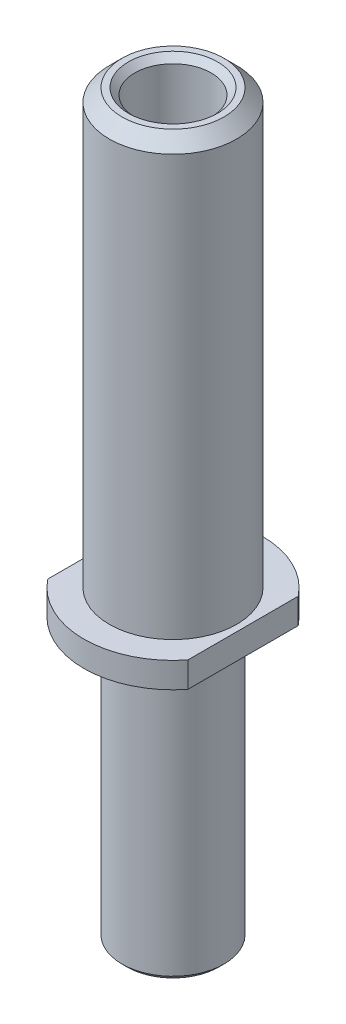
ISO-10303-21;
HEADER;
FILE_DESCRIPTION(('STEP AP214'),'2;1');
FILE_NAME('part.step','',(''),(''),'','','');
FILE_SCHEMA(('AUTOMOTIVE_DESIGN { 1 0 10303 214 1 1 1 1 }'));
ENDSEC;
DATA;
#1=APPLICATION_CONTEXT('core data for automotive mechanical design processes');
#2=APPLICATION_PROTOCOL_DEFINITION('international standard','automotive_design',2000,#1);
#3=PRODUCT_CONTEXT('',#1,'mechanical');
#4=PRODUCT('Part','Part','',(#3));
#5=PRODUCT_RELATED_PRODUCT_CATEGORY('part','',(#4));
#6=PRODUCT_DEFINITION_FORMATION('','',#4);
#7=PRODUCT_DEFINITION_CONTEXT('part definition',#1,'design');
#8=PRODUCT_DEFINITION('design','',#6,#7);
#9=PRODUCT_DEFINITION_SHAPE('','',#8);
#10=(LENGTH_UNIT() NAMED_UNIT(*) SI_UNIT(.MILLI.,.METRE.));
#11=(NAMED_UNIT(*) PLANE_ANGLE_UNIT() SI_UNIT($,.RADIAN.));
#12=(NAMED_UNIT(*) SI_UNIT($,.STERADIAN.) SOLID_ANGLE_UNIT());
#13=UNCERTAINTY_MEASURE_WITH_UNIT(LENGTH_MEASURE(1.E-05),#10,'distance_accuracy_value','');
#14=(GEOMETRIC_REPRESENTATION_CONTEXT(3) GLOBAL_UNCERTAINTY_ASSIGNED_CONTEXT((#13)) GLOBAL_UNIT_ASSIGNED_CONTEXT((#10,
#11,#12)) REPRESENTATION_CONTEXT('',''));
#15=CARTESIAN_POINT('',(0.,0.,0.));
#16=DIRECTION('',(0.,0.,1.));
#17=DIRECTION('',(1.,0.,0.));
#18=AXIS2_PLACEMENT_3D('',#15,#16,#17);
#19=CARTESIAN_POINT('',(0.,12.,3.5));
#20=DIRECTION('',(0.,1.,0.));
#21=DIRECTION('',(0.,0.,1.));
#22=AXIS2_PLACEMENT_3D('',#19,#20,#21);
#23=PLANE('',#22);
#24=CARTESIAN_POINT('',(0.,12.,0.));
#25=DIRECTION('',(0.,1.,0.));
#26=DIRECTION('',(0.,0.,1.));
#27=AXIS2_PLACEMENT_3D('',#24,#25,#26);
#28=CIRCLE('',#27,2.5);
#29=CARTESIAN_POINT('',(0.,12.,2.5));
#30=VERTEX_POINT('',#29);
#31=EDGE_CURVE('E121',#30,#30,#28,.T.);
#32=ORIENTED_EDGE('',*,*,#31,.F.);
#33=EDGE_LOOP('',(#32));
#34=FACE_BOUND('',#33,.T.);
#35=CARTESIAN_POINT('',(0.,12.,0.));
#36=DIRECTION('',(0.,1.,0.));
#37=DIRECTION('',(0.,0.,1.));
#38=AXIS2_PLACEMENT_3D('',#35,#36,#37);
#39=CIRCLE('',#38,3.5);
#40=CARTESIAN_POINT('',(2.75,12.,-2.16506350946109));
#41=VERTEX_POINT('',#40);
#42=CARTESIAN_POINT('',(-2.75,12.,-2.16506350946109));
#43=VERTEX_POINT('',#42);
#44=EDGE_CURVE('E120',#41,#43,#39,.T.);
#45=ORIENTED_EDGE('',*,*,#44,.T.);
#46=DIRECTION('',(0.,0.,-1.));
#47=VECTOR('',#46,1.);
#48=CARTESIAN_POINT('',(-2.75,12.,-2.16506350946109));
#49=LINE('',#48,#47);
#50=CARTESIAN_POINT('',(-2.75,12.,2.16506350946109));
#51=VERTEX_POINT('',#50);
#52=EDGE_CURVE('E94',#51,#43,#49,.T.);
#53=ORIENTED_EDGE('',*,*,#52,.F.);
#54=CARTESIAN_POINT('',(2.75,12.,2.16506350946109));
#55=VERTEX_POINT('',#54);
#56=EDGE_CURVE('E102',#51,#55,#39,.T.);
#57=ORIENTED_EDGE('',*,*,#56,.T.);
#58=DIRECTION('',(0.,0.,1.));
#59=VECTOR('',#58,1.);
#60=CARTESIAN_POINT('',(2.75,12.,-2.16506350946109));
#61=LINE('',#60,#59);
#62=EDGE_CURVE('E283',#41,#55,#61,.T.);
#63=ORIENTED_EDGE('',*,*,#62,.F.);
#64=EDGE_LOOP('',(#45,#53,#57,#63));
#65=FACE_BOUND('',#64,.T.);
#66=ADVANCED_FACE('F45',(#34,#65),#23,.T.);
#67=CARTESIAN_POINT('',(0.,29.,0.));
#68=DIRECTION('',(0.,1.,0.));
#69=DIRECTION('',(0.,0.,1.));
#70=AXIS2_PLACEMENT_3D('',#67,#68,#69);
#71=CYLINDRICAL_SURFACE('',#70,3.5);
#72=ORIENTED_EDGE('',*,*,#56,.F.);
#73=DIRECTION('',(0.,-1.,0.));
#74=VECTOR('',#73,1.);
#75=CARTESIAN_POINT('',(-2.75,29.001,2.16506350946109));
#76=LINE('',#75,#74);
#77=CARTESIAN_POINT('',(-2.75,11.,2.16506350946109));
#78=VERTEX_POINT('',#77);
#79=EDGE_CURVE('E87',#51,#78,#76,.T.);
#80=ORIENTED_EDGE('',*,*,#79,.T.);
#81=CARTESIAN_POINT('',(0.,11.,0.));
#82=DIRECTION('',(0.,1.,0.));
#83=DIRECTION('',(0.,0.,1.));
#84=AXIS2_PLACEMENT_3D('',#81,#82,#83);
#85=CIRCLE('',#84,3.5);
#86=CARTESIAN_POINT('',(2.75,11.,2.16506350946109));
#87=VERTEX_POINT('',#86);
#88=EDGE_CURVE('E100',#78,#87,#85,.T.);
#89=ORIENTED_EDGE('',*,*,#88,.T.);
#90=DIRECTION('',(0.,-1.,0.));
#91=VECTOR('',#90,1.);
#92=CARTESIAN_POINT('',(2.75,29.001,2.16506350946109));
#93=LINE('',#92,#91);
#94=EDGE_CURVE('E69',#55,#87,#93,.T.);
#95=ORIENTED_EDGE('',*,*,#94,.F.);
#96=EDGE_LOOP('',(#72,#80,#89,#95));
#97=FACE_BOUND('',#96,.T.);
#98=ADVANCED_FACE('F99',(#97),#71,.T.);
#99=CARTESIAN_POINT('',(2.75,11.,-2.16506350946109));
#100=VERTEX_POINT('',#99);
#101=CARTESIAN_POINT('',(-2.75,11.,-2.16506350946109));
#102=VERTEX_POINT('',#101);
#103=EDGE_CURVE('E108',#100,#102,#85,.T.);
#104=ORIENTED_EDGE('',*,*,#103,.T.);
#105=DIRECTION('',(0.,-1.,0.));
#106=VECTOR('',#105,1.);
#107=CARTESIAN_POINT('',(-2.75,29.001,-2.16506350946109));
#108=LINE('',#107,#106);
#109=EDGE_CURVE('E61',#43,#102,#108,.T.);
#110=ORIENTED_EDGE('',*,*,#109,.F.);
#111=ORIENTED_EDGE('',*,*,#44,.F.);
#112=DIRECTION('',(0.,-1.,0.));
#113=VECTOR('',#112,1.);
#114=CARTESIAN_POINT('',(2.75,29.001,-2.16506350946109));
#115=LINE('',#114,#113);
#116=EDGE_CURVE('E305',#41,#100,#115,.T.);
#117=ORIENTED_EDGE('',*,*,#116,.T.);
#118=EDGE_LOOP('',(#104,#110,#111,#117));
#119=FACE_BOUND('',#118,.T.);
#120=ADVANCED_FACE('F154',(#119),#71,.T.);
#121=CARTESIAN_POINT('',(0.,11.,2.));
#122=DIRECTION('',(0.,-1.,0.));
#123=DIRECTION('',(0.,0.,-1.));
#124=AXIS2_PLACEMENT_3D('',#121,#122,#123);
#125=PLANE('',#124);
#126=CARTESIAN_POINT('',(0.,11.,0.));
#127=DIRECTION('',(0.,1.,0.));
#128=DIRECTION('',(0.,0.,1.));
#129=AXIS2_PLACEMENT_3D('',#126,#127,#128);
#130=CIRCLE('',#129,2.);
#131=CARTESIAN_POINT('',(0.,11.,2.));
#132=VERTEX_POINT('',#131);
#133=EDGE_CURVE('E109',#132,#132,#130,.T.);
#134=ORIENTED_EDGE('',*,*,#133,.T.);
#135=EDGE_LOOP('',(#134));
#136=FACE_BOUND('',#135,.T.);
#137=ORIENTED_EDGE('',*,*,#88,.F.);
#138=DIRECTION('',(0.,0.,1.));
#139=VECTOR('',#138,1.);
#140=CARTESIAN_POINT('',(-2.75,11.,-2.16506350946109));
#141=LINE('',#140,#139);
#142=EDGE_CURVE('E84',#102,#78,#141,.T.);
#143=ORIENTED_EDGE('',*,*,#142,.F.);
#144=ORIENTED_EDGE('',*,*,#103,.F.);
#145=DIRECTION('',(0.,0.,-1.));
#146=VECTOR('',#145,1.);
#147=CARTESIAN_POINT('',(2.75,11.,-2.16506350946109));
#148=LINE('',#147,#146);
#149=EDGE_CURVE('E106',#87,#100,#148,.T.);
#150=ORIENTED_EDGE('',*,*,#149,.F.);
#151=EDGE_LOOP('',(#137,#143,#144,#150));
#152=FACE_BOUND('',#151,.T.);
#153=ADVANCED_FACE('F105',(#136,#152),#125,.T.);
#154=CARTESIAN_POINT('',(0.,28.75,0.));
#155=DIRECTION('',(0.,1.,0.));
#156=DIRECTION('',(0.,0.,1.));
#157=AXIS2_PLACEMENT_3D('',#154,#155,#156);
#158=CONICAL_SURFACE('',#157,1.5,0.785398163397448);
#159=CARTESIAN_POINT('',(0.,29.,0.));
#160=DIRECTION('',(0.,1.,0.));
#161=DIRECTION('',(0.,0.,1.));
#162=AXIS2_PLACEMENT_3D('',#159,#160,#161);
#163=CIRCLE('',#162,1.75);
#164=CARTESIAN_POINT('',(0.,29.,1.75));
#165=VERTEX_POINT('',#164);
#166=EDGE_CURVE('E11',#165,#165,#163,.T.);
#167=ORIENTED_EDGE('',*,*,#166,.T.);
#168=EDGE_LOOP('',(#167));
#169=FACE_BOUND('',#168,.T.);
#170=CARTESIAN_POINT('',(0.,28.75,0.));
#171=DIRECTION('',(0.,1.,0.));
#172=DIRECTION('',(0.,0.,1.));
#173=AXIS2_PLACEMENT_3D('',#170,#171,#172);
#174=CIRCLE('',#173,1.5);
#175=CARTESIAN_POINT('',(0.,28.75,1.5));
#176=VERTEX_POINT('',#175);
#177=EDGE_CURVE('E272',#176,#176,#174,.T.);
#178=ORIENTED_EDGE('',*,*,#177,.F.);
#179=EDGE_LOOP('',(#178));
#180=FACE_BOUND('',#179,.T.);
#181=ADVANCED_FACE('F47',(#169,#180),#158,.F.);
#182=CARTESIAN_POINT('',(0.,29.,1.75));
#183=DIRECTION('',(0.,1.,0.));
#184=DIRECTION('',(0.,0.,1.));
#185=AXIS2_PLACEMENT_3D('',#182,#183,#184);
#186=PLANE('',#185);
#187=CARTESIAN_POINT('',(0.,29.,0.));
#188=DIRECTION('',(0.,1.,0.));
#189=DIRECTION('',(0.,0.,1.));
#190=AXIS2_PLACEMENT_3D('',#187,#188,#189);
#191=CIRCLE('',#190,2.);
#192=CARTESIAN_POINT('',(0.,29.,2.));
#193=VERTEX_POINT('',#192);
#194=EDGE_CURVE('E54',#193,#193,#191,.T.);
#195=ORIENTED_EDGE('',*,*,#194,.T.);
#196=EDGE_LOOP('',(#195));
#197=FACE_BOUND('',#196,.T.);
#198=ORIENTED_EDGE('',*,*,#166,.F.);
#199=EDGE_LOOP('',(#198));
#200=FACE_BOUND('',#199,.T.);
#201=ADVANCED_FACE('F132',(#197,#200),#186,.T.);
#202=CARTESIAN_POINT('',(0.,29.,0.));
#203=DIRECTION('',(0.,-1.,0.));
#204=DIRECTION('',(0.,0.,-1.));
#205=AXIS2_PLACEMENT_3D('',#202,#203,#204);
#206=CONICAL_SURFACE('',#205,2.,0.785398163397448);
#207=CARTESIAN_POINT('',(0.,28.5,0.));
#208=DIRECTION('',(0.,1.,0.));
#209=DIRECTION('',(0.,0.,1.));
#210=AXIS2_PLACEMENT_3D('',#207,#208,#209);
#211=CIRCLE('',#210,2.5);
#212=CARTESIAN_POINT('',(0.,28.5,2.5));
#213=VERTEX_POINT('',#212);
#214=EDGE_CURVE('E125',#213,#213,#211,.T.);
#215=ORIENTED_EDGE('',*,*,#214,.T.);
#216=EDGE_LOOP('',(#215));
#217=FACE_BOUND('',#216,.T.);
#218=ORIENTED_EDGE('',*,*,#194,.F.);
#219=EDGE_LOOP('',(#218));
#220=FACE_BOUND('',#219,.T.);
#221=ADVANCED_FACE('F135',(#217,#220),#206,.T.);
#222=CARTESIAN_POINT('',(0.,29.,0.));
#223=DIRECTION('',(0.,1.,0.));
#224=DIRECTION('',(0.,0.,1.));
#225=AXIS2_PLACEMENT_3D('',#222,#223,#224);
#226=CYLINDRICAL_SURFACE('',#225,2.5);
#227=ORIENTED_EDGE('',*,*,#31,.T.);
#228=EDGE_LOOP('',(#227));
#229=FACE_BOUND('',#228,.T.);
#230=ORIENTED_EDGE('',*,*,#214,.F.);
#231=EDGE_LOOP('',(#230));
#232=FACE_BOUND('',#231,.T.);
#233=ADVANCED_FACE('F137',(#229,#232),#226,.T.);
#234=CARTESIAN_POINT('',(0.,29.,0.));
#235=DIRECTION('',(0.,1.,0.));
#236=DIRECTION('',(0.,0.,1.));
#237=AXIS2_PLACEMENT_3D('',#234,#235,#236);
#238=CYLINDRICAL_SURFACE('',#237,2.);
#239=CARTESIAN_POINT('',(0.,0.199999999999999,0.));
#240=DIRECTION('',(0.,1.,0.));
#241=DIRECTION('',(0.,0.,1.));
#242=AXIS2_PLACEMENT_3D('',#239,#240,#241);
#243=CIRCLE('',#242,2.);
#244=CARTESIAN_POINT('',(0.,0.199999999999999,2.));
#245=VERTEX_POINT('',#244);
#246=EDGE_CURVE('E114',#245,#245,#243,.T.);
#247=ORIENTED_EDGE('',*,*,#246,.T.);
#248=EDGE_LOOP('',(#247));
#249=FACE_BOUND('',#248,.T.);
#250=ORIENTED_EDGE('',*,*,#133,.F.);
#251=EDGE_LOOP('',(#250));
#252=FACE_BOUND('',#251,.T.);
#253=ADVANCED_FACE('F144',(#249,#252),#238,.T.);
#254=CARTESIAN_POINT('',(0.,0.199999999999999,0.));
#255=DIRECTION('',(0.,1.,0.));
#256=DIRECTION('',(0.,0.,1.));
#257=AXIS2_PLACEMENT_3D('',#254,#255,#256);
#258=CONICAL_SURFACE('',#257,2.,0.785398163397452);
#259=CARTESIAN_POINT('',(0.,0.,0.));
#260=DIRECTION('',(0.,1.,0.));
#261=DIRECTION('',(0.,0.,1.));
#262=AXIS2_PLACEMENT_3D('',#259,#260,#261);
#263=CIRCLE('',#262,1.8);
#264=CARTESIAN_POINT('',(0.,0.,1.8));
#265=VERTEX_POINT('',#264);
#266=EDGE_CURVE('E289',#265,#265,#263,.T.);
#267=ORIENTED_EDGE('',*,*,#266,.T.);
#268=EDGE_LOOP('',(#267));
#269=FACE_BOUND('',#268,.T.);
#270=ORIENTED_EDGE('',*,*,#246,.F.);
#271=EDGE_LOOP('',(#270));
#272=FACE_BOUND('',#271,.T.);
#273=ADVANCED_FACE('F164',(#269,#272),#258,.T.);
#274=CARTESIAN_POINT('',(0.,0.,1.7));
#275=DIRECTION('',(0.,-1.,0.));
#276=DIRECTION('',(0.,0.,-1.));
#277=AXIS2_PLACEMENT_3D('',#274,#275,#276);
#278=PLANE('',#277);
#279=CARTESIAN_POINT('',(0.,0.,0.));
#280=DIRECTION('',(0.,1.,0.));
#281=DIRECTION('',(0.,0.,1.));
#282=AXIS2_PLACEMENT_3D('',#279,#280,#281);
#283=CIRCLE('',#282,1.7);
#284=CARTESIAN_POINT('',(0.,0.,1.7));
#285=VERTEX_POINT('',#284);
#286=EDGE_CURVE('E279',#285,#285,#283,.T.);
#287=ORIENTED_EDGE('',*,*,#286,.T.);
#288=EDGE_LOOP('',(#287));
#289=FACE_BOUND('',#288,.T.);
#290=ORIENTED_EDGE('',*,*,#266,.F.);
#291=EDGE_LOOP('',(#290));
#292=FACE_BOUND('',#291,.T.);
#293=ADVANCED_FACE('F168',(#289,#292),#278,.T.);
#294=CARTESIAN_POINT('',(0.,0.,0.));
#295=DIRECTION('',(0.,-1.,0.));
#296=DIRECTION('',(0.,0.,-1.));
#297=AXIS2_PLACEMENT_3D('',#294,#295,#296);
#298=CONICAL_SURFACE('',#297,1.7,0.785398163397452);
#299=CARTESIAN_POINT('',(0.,0.199999999999999,0.));
#300=DIRECTION('',(0.,1.,0.));
#301=DIRECTION('',(0.,0.,1.));
#302=AXIS2_PLACEMENT_3D('',#299,#300,#301);
#303=CIRCLE('',#302,1.5);
#304=CARTESIAN_POINT('',(0.,0.199999999999999,1.5));
#305=VERTEX_POINT('',#304);
#306=EDGE_CURVE('E274',#305,#305,#303,.T.);
#307=ORIENTED_EDGE('',*,*,#306,.T.);
#308=EDGE_LOOP('',(#307));
#309=FACE_BOUND('',#308,.T.);
#310=ORIENTED_EDGE('',*,*,#286,.F.);
#311=EDGE_LOOP('',(#310));
#312=FACE_BOUND('',#311,.T.);
#313=ADVANCED_FACE('F172',(#309,#312),#298,.F.);
#314=CARTESIAN_POINT('',(0.,29.,0.));
#315=DIRECTION('',(0.,1.,0.));
#316=DIRECTION('',(0.,0.,1.));
#317=AXIS2_PLACEMENT_3D('',#314,#315,#316);
#318=CYLINDRICAL_SURFACE('',#317,1.5);
#319=ORIENTED_EDGE('',*,*,#177,.T.);
#320=EDGE_LOOP('',(#319));
#321=FACE_BOUND('',#320,.T.);
#322=ORIENTED_EDGE('',*,*,#306,.F.);
#323=EDGE_LOOP('',(#322));
#324=FACE_BOUND('',#323,.T.);
#325=ADVANCED_FACE('F176',(#321,#324),#318,.F.);
#326=CARTESIAN_POINT('',(2.75,29.001,-2.16506350946109));
#327=DIRECTION('',(1.,0.,0.));
#328=DIRECTION('',(0.,0.,-1.));
#329=AXIS2_PLACEMENT_3D('',#326,#327,#328);
#330=PLANE('',#329);
#331=ORIENTED_EDGE('',*,*,#62,.T.);
#332=ORIENTED_EDGE('',*,*,#94,.T.);
#333=ORIENTED_EDGE('',*,*,#149,.T.);
#334=ORIENTED_EDGE('',*,*,#116,.F.);
#335=EDGE_LOOP('',(#331,#332,#333,#334));
#336=FACE_BOUND('',#335,.T.);
#337=ADVANCED_FACE('F179',(#336),#330,.T.);
#338=CARTESIAN_POINT('',(-2.75,29.001,-2.16506350946109));
#339=DIRECTION('',(-1.,0.,0.));
#340=DIRECTION('',(0.,0.,1.));
#341=AXIS2_PLACEMENT_3D('',#338,#339,#340);
#342=PLANE('',#341);
#343=ORIENTED_EDGE('',*,*,#52,.T.);
#344=ORIENTED_EDGE('',*,*,#109,.T.);
#345=ORIENTED_EDGE('',*,*,#142,.T.);
#346=ORIENTED_EDGE('',*,*,#79,.F.);
#347=EDGE_LOOP('',(#343,#344,#345,#346));
#348=FACE_BOUND('',#347,.T.);
#349=ADVANCED_FACE('F86',(#348),#342,.T.);
#350=CLOSED_SHELL('',(#66,#98,#120,#153,#181,#201,#221,#233,#253,#273,#293,#313,#325,#337,#349));
#351=MANIFOLD_SOLID_BREP('B2',#350);
#352=ADVANCED_BREP_SHAPE_REPRESENTATION('',(#18,#351),#14);
#353=SHAPE_DEFINITION_REPRESENTATION(#9,#352);
ENDSEC;
END-ISO-10303-21;
